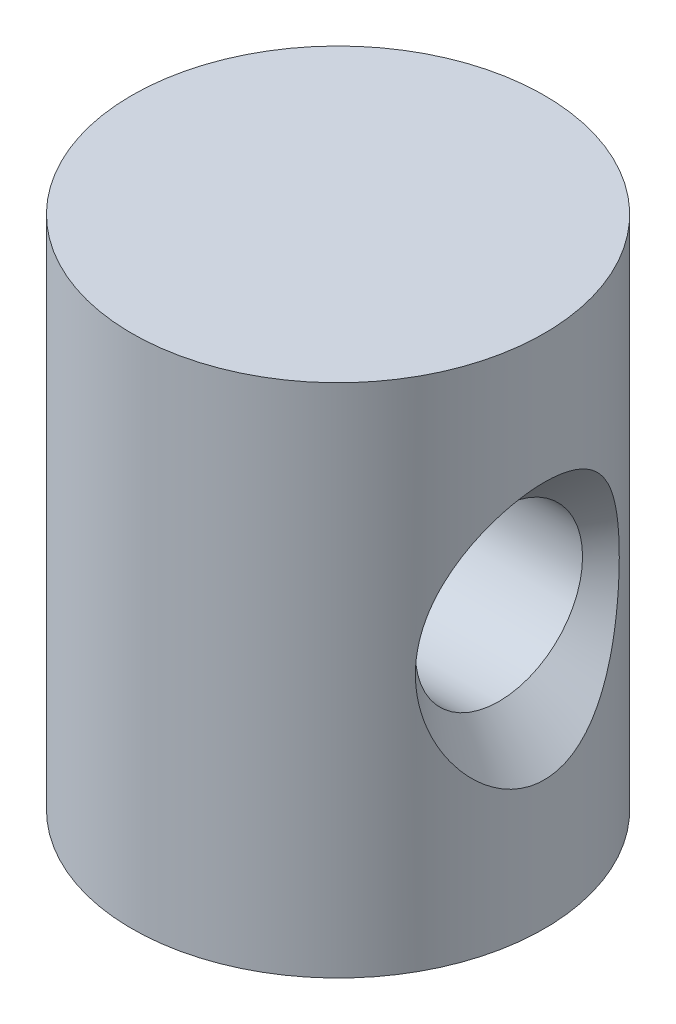
ISO-10303-21;
HEADER;
FILE_DESCRIPTION(('STEP AP214'),'2;1');
FILE_NAME('part.step','',(''),(''),'','','');
FILE_SCHEMA(('AUTOMOTIVE_DESIGN { 1 0 10303 214 1 1 1 1 }'));
ENDSEC;
DATA;
#1=APPLICATION_CONTEXT('core data for automotive mechanical design processes');
#2=APPLICATION_PROTOCOL_DEFINITION('international standard','automotive_design',2000,#1);
#3=PRODUCT_CONTEXT('',#1,'mechanical');
#4=PRODUCT('Part','Part','',(#3));
#5=PRODUCT_RELATED_PRODUCT_CATEGORY('part','',(#4));
#6=PRODUCT_DEFINITION_FORMATION('','',#4);
#7=PRODUCT_DEFINITION_CONTEXT('part definition',#1,'design');
#8=PRODUCT_DEFINITION('design','',#6,#7);
#9=PRODUCT_DEFINITION_SHAPE('','',#8);
#10=(LENGTH_UNIT() NAMED_UNIT(*) SI_UNIT(.MILLI.,.METRE.));
#11=(NAMED_UNIT(*) PLANE_ANGLE_UNIT() SI_UNIT($,.RADIAN.));
#12=(NAMED_UNIT(*) SI_UNIT($,.STERADIAN.) SOLID_ANGLE_UNIT());
#13=UNCERTAINTY_MEASURE_WITH_UNIT(LENGTH_MEASURE(1.E-05),#10,'distance_accuracy_value','');
#14=(GEOMETRIC_REPRESENTATION_CONTEXT(3) GLOBAL_UNCERTAINTY_ASSIGNED_CONTEXT((#13)) GLOBAL_UNIT_ASSIGNED_CONTEXT((#10,
#11,#12)) REPRESENTATION_CONTEXT('',''));
#15=CARTESIAN_POINT('',(0.,0.,0.));
#16=DIRECTION('',(0.,0.,1.));
#17=DIRECTION('',(1.,0.,0.));
#18=AXIS2_PLACEMENT_3D('',#15,#16,#17);
#19=CARTESIAN_POINT('',(0.,0.,0.));
#20=DIRECTION('',(0.,1.,0.));
#21=DIRECTION('',(0.,0.,-1.));
#22=AXIS2_PLACEMENT_3D('',#19,#20,#21);
#23=PLANE('',#22);
#24=CARTESIAN_POINT('',(0.,0.,0.));
#25=DIRECTION('',(0.,1.,0.));
#26=DIRECTION('',(-1.,0.,0.));
#27=AXIS2_PLACEMENT_3D('',#24,#25,#26);
#28=CIRCLE('',#27,4.);
#29=CARTESIAN_POINT('',(-4.,0.,0.));
#30=VERTEX_POINT('',#29);
#31=EDGE_CURVE('E57',#30,#30,#28,.T.);
#32=ORIENTED_EDGE('',*,*,#31,.T.);
#33=EDGE_LOOP('',(#32));
#34=FACE_BOUND('',#33,.T.);
#35=ADVANCED_FACE('F20',(#34),#23,.T.);
#36=CARTESIAN_POINT('',(0.,-10.,0.));
#37=DIRECTION('',(0.,1.,0.));
#38=DIRECTION('',(0.,0.,-1.));
#39=AXIS2_PLACEMENT_3D('',#36,#37,#38);
#40=PLANE('',#39);
#41=CARTESIAN_POINT('',(0.,-10.,0.));
#42=DIRECTION('',(0.,1.,0.));
#43=DIRECTION('',(-1.,0.,0.));
#44=AXIS2_PLACEMENT_3D('',#41,#42,#43);
#45=CIRCLE('',#44,4.);
#46=CARTESIAN_POINT('',(-4.,-10.,0.));
#47=VERTEX_POINT('',#46);
#48=EDGE_CURVE('E61',#47,#47,#45,.T.);
#49=ORIENTED_EDGE('',*,*,#48,.F.);
#50=EDGE_LOOP('',(#49));
#51=FACE_BOUND('',#50,.T.);
#52=ADVANCED_FACE('F111',(#51),#40,.F.);
#53=CARTESIAN_POINT('',(-4.,-5.,0.));
#54=DIRECTION('',(1.,0.,0.));
#55=DIRECTION('',(0.,1.,0.));
#56=AXIS2_PLACEMENT_3D('',#53,#54,#55);
#57=CYLINDRICAL_SURFACE('',#56,1.62111388575);
#58=CARTESIAN_POINT('',(-4.,-6.62111388575064,0.));
#59=CARTESIAN_POINT('',(-4.0000031563465,-6.6211166341962,-0.0340424655582793));
#60=CARTESIAN_POINT('',(-3.9991283741432,-6.61896729615456,-0.102102118052919));
#61=CARTESIAN_POINT('',(-3.99523878132131,-6.60934312198981,-0.203696124763147));
#62=CARTESIAN_POINT('',(-3.98811309567497,-6.59159958210959,-0.315525051694384));
#63=CARTESIAN_POINT('',(-3.97580413230919,-6.5606034394443,-0.447539362889413));
#64=CARTESIAN_POINT('',(-3.95580844935516,-6.50916375295717,-0.600436499064749));
#65=CARTESIAN_POINT('',(-3.9294737814188,-6.43893984092048,-0.752850624426931));
#66=CARTESIAN_POINT('',(-3.90051334808016,-6.35793544211989,-0.889622135762058));
#67=CARTESIAN_POINT('',(-3.87065284250014,-6.26982597941075,-1.01134800296146));
#68=CARTESIAN_POINT('',(-3.83358932772209,-6.15320612306202,-1.14497003034035));
#69=CARTESIAN_POINT('',(-3.78847992918991,-5.99589858506257,-1.28669053179811));
#70=CARTESIAN_POINT('',(-3.73928385536563,-5.79088567214044,-1.42247226859986));
#71=CARTESIAN_POINT('',(-3.70074468915172,-5.58134969620263,-1.51877881119369));
#72=CARTESIAN_POINT('',(-3.67482545953551,-5.37886876145371,-1.58000035688838));
#73=CARTESIAN_POINT('',(-3.66051794533255,-5.19614618858887,-1.61268838122111));
#74=CARTESIAN_POINT('',(-3.65690239272469,-5.06901625099303,-1.6208221871858));
#75=CARTESIAN_POINT('',(-3.65667087874105,-4.95424275231737,-1.621344555527));
#76=CARTESIAN_POINT('',(-3.65891590006348,-4.84662470350787,-1.61629271365919));
#77=CARTESIAN_POINT('',(-3.66853818385199,-4.69351073946442,-1.59441444805777));
#78=CARTESIAN_POINT('',(-3.68431092026829,-4.54234496588776,-1.55775328714847));
#79=CARTESIAN_POINT('',(-3.70544315534763,-4.39583155647951,-1.50697426063406));
#80=CARTESIAN_POINT('',(-3.73113523736669,-4.2546961106903,-1.44241705564248));
#81=CARTESIAN_POINT('',(-3.76053154464821,-4.11961100303797,-1.36422969273934));
#82=CARTESIAN_POINT('',(-3.79646829349626,-3.97632714034477,-1.26165104029577));
#83=CARTESIAN_POINT('',(-3.84083046670621,-3.82184845053826,-1.12170373757784));
#84=CARTESIAN_POINT('',(-3.89019093106858,-3.67050169278256,-0.938652135085345));
#85=CARTESIAN_POINT('',(-3.93177156992079,-3.5545395751291,-0.744231026198825));
#86=CARTESIAN_POINT('',(-3.96089622378604,-3.47761865991002,-0.565596344808428));
#87=CARTESIAN_POINT('',(-3.97934168461757,-3.43043273254769,-0.4143648096029));
#88=CARTESIAN_POINT('',(-3.9908100093343,-3.40165850312901,-0.280489101841771));
#89=CARTESIAN_POINT('',(-3.99672218940415,-3.38698450511603,-0.171311982666344));
#90=CARTESIAN_POINT('',(-3.99946121555641,-3.38021380402062,-0.0799570663653172));
#91=CARTESIAN_POINT('',(-4.00000171402734,-3.37888409713703,-0.0271568617674381));
#92=CARTESIAN_POINT('',(-4.,-3.37888611425,-5.36675928995767E-09));
#93=(BOUNDED_CURVE() B_SPLINE_CURVE(3,(#58,#59,#60,#61,#62,#63,#64,#65,#66,#67,#68,#69,#70,#71,
#72,#73,#74,#75,#76,#77,#78,#79,#80,#81,#82,#83,#84,#85,#86,#87,#88,#89,#90,#91,#92),
.UNSPECIFIED.,.F.,.F.) B_SPLINE_CURVE_WITH_KNOTS((4,1,1,1,1,1,1,1,1,1,1,1,1,1,1,1,1,1,1,1,1,1,1,
1,1,1,1,1,1,1,1,1,4),(0.,0.0198243570351821,0.0396438891503337,0.0594619951406752,
0.0858742539006231,0.118882069184403,0.154015924613544,0.184673792051416,0.212907971191001,
0.243185035390973,0.290128115607845,0.338704421606987,0.388894216455981,0.425881496405948,
0.462652492690109,0.497129731561603,0.499995819584017,0.52952044443138,0.559828609511032,
0.590145160333224,0.620496278252955,0.650880790520131,0.681698325661038,0.712916155050212,
0.75554847229542,0.805597074099872,0.853843286632708,0.889256957110858,0.91996930607599,
0.946638885231652,0.969230098030099,0.984166803630804,1.),
.UNSPECIFIED.) CURVE() GEOMETRIC_REPRESENTATION_ITEM() RATIONAL_B_SPLINE_CURVE((1.,1.,1.,1.,1.,
1.,1.,1.,1.,1.,1.,1.,1.,1.,1.,1.,1.,1.,1.,1.,1.,1.,1.,1.,1.,1.,1.,1.,1.,1.,1.,1.,1.,1.,1.)) REPRESENTATION_ITEM(''));
#94=CARTESIAN_POINT('',(-4.,-6.62111388575128,0.));
#95=VERTEX_POINT('',#94);
#96=CARTESIAN_POINT('',(-4.,-3.37888611425,0.));
#97=VERTEX_POINT('',#96);
#98=EDGE_CURVE('E67',#95,#97,#93,.T.);
#99=ORIENTED_EDGE('',*,*,#98,.F.);
#100=CARTESIAN_POINT('',(-4.,-3.37888611425,0.));
#101=CARTESIAN_POINT('',(-4.00000315669832,-3.37888336549198,0.0340443126539728));
#102=CARTESIAN_POINT('',(-3.99912832674584,-3.38103282040371,0.10210396419752));
#103=CARTESIAN_POINT('',(-3.99523866523971,-3.39065716701071,0.203697946046601));
#104=CARTESIAN_POINT('',(-3.98811309568607,-3.4084004178819,0.31552505169295));
#105=CARTESIAN_POINT('',(-3.97580413230465,-3.43939656055973,0.447539362892866));
#106=CARTESIAN_POINT('',(-3.9558084493565,-3.4908362470418,0.600436499064278));
#107=CARTESIAN_POINT('',(-3.92947378141848,-3.5610601590798,0.752850624427102));
#108=CARTESIAN_POINT('',(-3.90051334808023,-3.64206455788005,0.889622135762016));
#109=CARTESIAN_POINT('',(-3.87065284250012,-3.73017402058927,1.01134800296147));
#110=CARTESIAN_POINT('',(-3.8335893277221,-3.84679387693797,1.14497003034034));
#111=CARTESIAN_POINT('',(-3.78847992918991,-4.00410141493744,1.28669053179811));
#112=CARTESIAN_POINT('',(-3.73928385536563,-4.20911432785956,1.42247226859985));
#113=CARTESIAN_POINT('',(-3.70074468915172,-4.41865030379738,1.51877881119368));
#114=CARTESIAN_POINT('',(-3.67482545953551,-4.6211312385463,1.58000035688837));
#115=CARTESIAN_POINT('',(-3.66051794533255,-4.80385381141113,1.6126883812211));
#116=CARTESIAN_POINT('',(-3.65690239272469,-4.93098374900698,1.6208221871858));
#117=CARTESIAN_POINT('',(-3.65667087874105,-5.04575724768262,1.621344555527));
#118=CARTESIAN_POINT('',(-3.65891590006348,-5.15337529649213,1.61629271365918));
#119=CARTESIAN_POINT('',(-3.66853818385199,-5.30648926053558,1.59441444805776));
#120=CARTESIAN_POINT('',(-3.68431092026829,-5.45765503411224,1.55775328714847));
#121=CARTESIAN_POINT('',(-3.70544315534763,-5.60416844352049,1.50697426063406));
#122=CARTESIAN_POINT('',(-3.73113523736668,-5.7453038893097,1.44241705564248));
#123=CARTESIAN_POINT('',(-3.76053154464821,-5.88038899696202,1.36422969273932));
#124=CARTESIAN_POINT('',(-3.79646829349626,-6.02367285965523,1.26165104029582));
#125=CARTESIAN_POINT('',(-3.84083046670621,-6.17815154946174,1.12170373757758));
#126=CARTESIAN_POINT('',(-3.89019093106858,-6.32949830721743,0.938652135086503));
#127=CARTESIAN_POINT('',(-3.93177156992079,-6.44546042487091,0.74423102619518));
#128=CARTESIAN_POINT('',(-3.96089622378604,-6.52238134008997,0.565596344817542));
#129=CARTESIAN_POINT('',(-3.97934168461757,-6.56956726745231,0.414364809575248));
#130=CARTESIAN_POINT('',(-3.9908100093343,-6.59834149687098,0.280489101924734));
#131=CARTESIAN_POINT('',(-3.99672218940415,-6.61301549488402,0.171311982444031));
#132=CARTESIAN_POINT('',(-3.99946121555641,-6.61978619597928,0.0799570669043548));
#133=CARTESIAN_POINT('',(-4.00000171402734,-6.62111590286322,0.0271568605122614));
#134=CARTESIAN_POINT('',(-4.,-6.62111388575064,2.15696118997857E-09));
#135=(BOUNDED_CURVE() B_SPLINE_CURVE(3,(#100,#101,#102,#103,#104,#105,#106,#107,#108,#109,#110,
#111,#112,#113,#114,#115,#116,#117,#118,#119,#120,#121,#122,#123,#124,#125,#126,#127,#128,#129,
#130,#131,#132,#133,#134),.UNSPECIFIED.,.F.,.F.) B_SPLINE_CURVE_WITH_KNOTS((4,1,1,1,1,1,1,1,1,1,
1,1,1,1,1,1,1,1,1,1,1,1,1,1,1,1,1,1,1,1,1,1,4),(0.,0.0198254327335299,0.0396438891524231,
0.0594619951411881,0.0858742539007881,0.118882069184395,0.154015924613537,0.18467379205141,
0.212907971190994,0.243185035390966,0.290128115607839,0.338704421606981,0.388894216455975,
0.425881496405943,0.462652492690104,0.497129731561599,0.499995819584012,0.529520444431375,
0.559828609511028,0.590145160333219,0.62049627825295,0.650880790520128,0.681698325661035,
0.712916155050208,0.755548472295417,0.805597074099869,0.853843286632703,0.889256957110856,
0.919969306075988,0.94663888523165,0.969230098030106,0.984166803630812,1.),
.UNSPECIFIED.) CURVE() GEOMETRIC_REPRESENTATION_ITEM() RATIONAL_B_SPLINE_CURVE((1.,1.,1.,1.,1.,
1.,1.,1.,1.,1.,1.,1.,1.,1.,1.,1.,1.,1.,1.,1.,1.,1.,1.,1.,1.,1.,1.,1.,1.,1.,1.,1.,1.,1.,1.)) REPRESENTATION_ITEM(''));
#136=EDGE_CURVE('E60',#97,#95,#135,.T.);
#137=ORIENTED_EDGE('',*,*,#136,.F.);
#138=EDGE_LOOP('',(#99,#137));
#139=FACE_BOUND('',#138,.T.);
#140=CARTESIAN_POINT('',(3.12111388575,-5.,0.));
#141=DIRECTION('',(1.,0.,0.));
#142=DIRECTION('',(0.,1.,0.));
#143=AXIS2_PLACEMENT_3D('',#140,#141,#142);
#144=CIRCLE('',#143,1.62111388575);
#145=CARTESIAN_POINT('',(3.12111388575,-3.37888611425,0.));
#146=VERTEX_POINT('',#145);
#147=EDGE_CURVE('E12',#146,#146,#144,.T.);
#148=ORIENTED_EDGE('',*,*,#147,.T.);
#149=EDGE_LOOP('',(#148));
#150=FACE_BOUND('',#149,.T.);
#151=ADVANCED_FACE('F103',(#139,#150),#57,.F.);
#152=CARTESIAN_POINT('',(3.56055758567445,-5.,0.));
#153=DIRECTION('',(1.,0.,0.));
#154=DIRECTION('',(0.,1.,0.));
#155=AXIS2_PLACEMENT_3D('',#152,#153,#154);
#156=CONICAL_SURFACE('',#155,2.06055758567445,0.785398163397448);
#157=CARTESIAN_POINT('',(4.00000000000051,-2.49999999999949,3.57056918753873E-12));
#158=CARTESIAN_POINT('',(3.99999996586396,-2.50000003802693,-0.030121704228556));
#159=CARTESIAN_POINT('',(3.99933834679552,-2.50171965236509,-0.0886551598392516));
#160=CARTESIAN_POINT('',(3.99639128501168,-2.5093905943826,-0.177263054994165));
#161=CARTESIAN_POINT('',(3.99131702137036,-2.52263551490217,-0.269104908488694));
#162=CARTESIAN_POINT('',(3.98241320718837,-2.54598483297339,-0.381528681956324));
#163=CARTESIAN_POINT('',(3.96781820478604,-2.58456926022726,-0.513545920062348));
#164=CARTESIAN_POINT('',(3.94593271319445,-2.64329633188486,-0.661157702460623));
#165=CARTESIAN_POINT('',(3.91981796567723,-2.71483493244556,-0.800870810995421));
#166=CARTESIAN_POINT('',(3.89031234689391,-2.79774184931408,-0.933267921452824));
#167=CARTESIAN_POINT('',(3.85716069850274,-2.89364285637817,-1.06229777079005));
#168=CARTESIAN_POINT('',(3.81840657256043,-3.01013062634908,-1.1942916876901));
#169=CARTESIAN_POINT('',(3.77402777102267,-3.15049408480559,-1.3278824803699));
#170=CARTESIAN_POINT('',(3.72628308608884,-3.31184866125678,-1.45631910068388));
#171=CARTESIAN_POINT('',(3.67698836978961,-3.49337558016868,-1.57635505127635));
#172=CARTESIAN_POINT('',(3.62906012583438,-3.69023912384516,-1.68344619252777));
#173=CARTESIAN_POINT('',(3.58454736654103,-3.90060870623639,-1.77594287992062));
#174=CARTESIAN_POINT('',(3.54568885053803,-4.12091625549376,-1.85203096912344));
#175=CARTESIAN_POINT('',(3.51414404627967,-4.34933535408078,-1.91098332937587));
#176=CARTESIAN_POINT('',(3.49137393998363,-4.58328100700552,-1.95211033716789));
#177=CARTESIAN_POINT('',(3.47946775690529,-4.80101739021413,-1.97315617035474));
#178=CARTESIAN_POINT('',(3.47683865881683,-4.96098615117532,-1.97777485735494));
#179=CARTESIAN_POINT('',(3.4777561309333,-5.12241879631714,-1.976160757368));
#180=CARTESIAN_POINT('',(3.48400520778564,-5.30760479043545,-1.96518076833696));
#181=CARTESIAN_POINT('',(3.50343813736603,-5.5550642602611,-1.9304883469209));
#182=CARTESIAN_POINT('',(3.53387907238733,-5.80275179332248,-1.8744564028676));
#183=CARTESIAN_POINT('',(3.57389608403542,-6.04465635160734,-1.79734381832013));
#184=CARTESIAN_POINT('',(3.62091551941573,-6.27441486419591,-1.70101906818169));
#185=CARTESIAN_POINT('',(3.67225059990424,-6.48873771390361,-1.58757009988617));
#186=CARTESIAN_POINT('',(3.72415583493882,-6.68088319609502,-1.46195391987626));
#187=CARTESIAN_POINT('',(3.77348303660644,-6.84774017665104,-1.32944644546857));
#188=CARTESIAN_POINT('',(3.82031701223636,-6.9959505990072,-1.18862191656326));
#189=CARTESIAN_POINT('',(3.86352918986095,-7.12531635412874,-1.04017961293357));
#190=CARTESIAN_POINT('',(3.90166518762731,-7.23455861364833,-0.885990775068883));
#191=CARTESIAN_POINT('',(3.93169801921501,-7.31789584409016,-0.740605674522871));
#192=CARTESIAN_POINT('',(3.95723073407728,-7.38717634067478,-0.590125318945098));
#193=CARTESIAN_POINT('',(3.97985839891794,-7.44738700474906,-0.416622785658002));
#194=CARTESIAN_POINT('',(3.99615504700983,-7.49002268770277,-0.215030469467505));
#195=CARTESIAN_POINT('',(4.00009945863062,-7.50025859063732,-0.066721697897177));
#196=CARTESIAN_POINT('',(3.99988939163708,-7.49971236447106,0.0821980457194884));
#197=CARTESIAN_POINT('',(3.99511468053135,-7.48732261147424,0.236010910464835));
#198=CARTESIAN_POINT('',(3.97582959294541,-7.43679292322488,0.456927803732192));
#199=CARTESIAN_POINT('',(3.94485182725808,-7.35403001820525,0.673607393161241));
#200=CARTESIAN_POINT('',(3.90479562307475,-7.24371998568687,0.875084113162794));
#201=CARTESIAN_POINT('',(3.86011010520051,-7.11542204378461,1.0530854832262));
#202=CARTESIAN_POINT('',(3.8111919014095,-6.96803030781393,1.21825558963246));
#203=CARTESIAN_POINT('',(3.75649356654919,-6.79270389448881,1.37794826552703));
#204=CARTESIAN_POINT('',(3.69496051315124,-6.57671349037276,1.53498126611675));
#205=CARTESIAN_POINT('',(3.63783838121459,-6.34922144642304,1.66478970110569));
#206=CARTESIAN_POINT('',(3.58870344334002,-6.12058261396534,1.76756252841836));
#207=CARTESIAN_POINT('',(3.5491398747403,-5.90069641686376,1.84543464527024));
#208=CARTESIAN_POINT('',(3.51682079977397,-5.67297289066085,1.9060725635655));
#209=CARTESIAN_POINT('',(3.49298045617475,-5.43769057008733,1.94925007866439));
#210=CARTESIAN_POINT('',(3.47983712978871,-5.21260585510045,1.97250939918933));
#211=CARTESIAN_POINT('',(3.47686780420752,-5.04850149787139,1.97772360400085));
#212=CARTESIAN_POINT('',(3.47765513899741,-4.88173898500962,1.97633841846665));
#213=CARTESIAN_POINT('',(3.48366489384752,-4.69748363614982,1.96578528266537));
#214=CARTESIAN_POINT('',(3.50295815198896,-4.45041215557217,1.93134971509302));
#215=CARTESIAN_POINT('',(3.53228674478635,-4.20925114334913,1.87740550274844));
#216=CARTESIAN_POINT('',(3.5700523721221,-3.97701779396228,1.80485653294797));
#217=CARTESIAN_POINT('',(3.6143069606544,-3.75608208146934,1.71484828963605));
#218=CARTESIAN_POINT('',(3.66647669641623,-3.5332798537881,1.60101309551273));
#219=CARTESIAN_POINT('',(3.72437692446551,-3.31712594509025,1.46239432122484));
#220=CARTESIAN_POINT('',(3.78431002180873,-3.11636288984567,1.29975826473886));
#221=CARTESIAN_POINT('',(3.83312752942204,-2.96515397288305,1.14672087718614));
#222=CARTESIAN_POINT('',(3.87043096592492,-2.85499572165633,1.01209867458446));
#223=CARTESIAN_POINT('',(3.89740071771256,-2.77773703938814,0.902347163016379));
#224=CARTESIAN_POINT('',(3.92028077386662,-2.71369717313857,0.796896379980265));
#225=CARTESIAN_POINT('',(3.93997275403655,-2.65960114454342,0.693108001816476));
#226=CARTESIAN_POINT('',(3.95729057112336,-2.6127691203032,0.58637492150595));
#227=CARTESIAN_POINT('',(3.97174853138577,-2.57417891475397,0.478724241726292));
#228=CARTESIAN_POINT('',(3.98303551035519,-2.54435618822256,0.372862870623317));
#229=CARTESIAN_POINT('',(3.99086656039665,-2.52381474588129,0.275457021820679));
#230=CARTESIAN_POINT('',(3.99584187157413,-2.51082341095786,0.188174530936989));
#231=CARTESIAN_POINT('',(3.99853838574965,-2.50380128309442,0.114943420591218));
#232=CARTESIAN_POINT('',(3.99977048422398,-2.50059665825529,0.053199313016184));
#233=CARTESIAN_POINT('',(4.00000001906644,-2.49999997876042,0.0168235659600927));
#234=CARTESIAN_POINT('',(4.00000000000051,-2.49999999999949,3.57056918753873E-12));
#235=(BOUNDED_CURVE() B_SPLINE_CURVE(3,(#157,#158,#159,#160,#161,#162,#163,#164,#165,#166,#167,
#168,#169,#170,#171,#172,#173,#174,#175,#176,#177,#178,#179,#180,#181,#182,#183,#184,#185,#186,
#187,#188,#189,#190,#191,#192,#193,#194,#195,#196,#197,#198,#199,#200,#201,#202,#203,#204,#205,
#206,#207,#208,#209,#210,#211,#212,#213,#214,#215,#216,#217,#218,#219,#220,#221,#222,#223,#224,
#225,#226,#227,#228,#229,#230,#231,#232,#233,#234),.UNSPECIFIED.,.T.,
.F.) B_SPLINE_CURVE_WITH_KNOTS((4,1,1,1,1,1,1,1,1,1,1,1,1,1,1,1,1,1,1,1,1,1,1,1,1,1,1,1,1,1,1,1,
1,1,1,1,1,1,1,1,1,1,1,1,1,1,1,1,1,1,1,1,1,1,1,1,1,1,1,1,1,1,1,1,1,1,1,1,1,1,1,1,1,1,1,4),(-1.,
-0.993673230500097,-0.987704091604336,-0.981334490386021,-0.974187646477769,-0.963545562729502,
-0.952335242425189,-0.940568364080829,-0.930177422990681,-0.918988901291006,-0.906125083493818,
-0.892369847583536,-0.877273771994394,-0.861723308650029,-0.845545779291276,-0.82919200886838,
-0.812606199291329,-0.795964363874261,-0.779255433258084,-0.762536867556295,-0.75000115551451,
-0.745659163108416,-0.728632714835445,-0.711057135387509,-0.693079553648356,-0.674972417812414,
-0.65713590781791,-0.639889732475611,-0.622964604955863,-0.607771208864449,-0.593994294288688,
-0.578966078791786,-0.565490636975541,-0.553569973137078,-0.543262380818354,-0.530336492178955,
-0.514792834658619,-0.499999530506823,-0.499209805318204,-0.483537495273062,-0.467696117276082,
-0.451608880597478,-0.434542345525534,-0.418861510107143,-0.404670468488887,-0.386987071789252,
-0.367831244249632,-0.347203820421086,-0.330771484185481,-0.314232768830158,-0.297559902611482,
-0.280860061718423,-0.263795837532416,-0.250002706119652,-0.246395592916059,-0.228773278426973,
-0.211264775099838,-0.19390056278233,-0.176564822363477,-0.159604680950615,-0.142991431691406,
-0.122942975611842,-0.104403360637435,-0.0873733707702689,-0.0766918219448359,
-0.0670700087161006,-0.0586500832756551,-0.0503613399509329,-0.04217073510334,
-0.0339276074728999,-0.0261854002041523,-0.0189767670897422,-0.0129772457942846,
-0.00763983970299969,-0.00353362555959901,0.),
.UNSPECIFIED.) CURVE() GEOMETRIC_REPRESENTATION_ITEM() RATIONAL_B_SPLINE_CURVE((1.,1.,1.,1.,1.,
1.,1.,1.,1.,1.,1.,1.,1.,1.,1.,1.,1.,1.,1.,1.,1.,1.,1.,1.,1.,1.,1.,1.,1.,1.,1.,1.,1.,1.,1.,1.,1.,
1.,1.,1.,1.,1.,1.,1.,1.,1.,1.,1.,1.,1.,1.,1.,1.,1.,1.,1.,1.,1.,1.,1.,1.,1.,1.,1.,1.,1.,1.,1.,1.,
1.,1.,1.,1.,1.,1.,1.,1.,1.)) REPRESENTATION_ITEM(''));
#236=CARTESIAN_POINT('',(4.00000000000101,-2.49999999999899,0.));
#237=VERTEX_POINT('',#236);
#238=EDGE_CURVE('E29',#237,#237,#235,.T.);
#239=ORIENTED_EDGE('',*,*,#238,.F.);
#240=EDGE_LOOP('',(#239));
#241=FACE_BOUND('',#240,.T.);
#242=ORIENTED_EDGE('',*,*,#147,.F.);
#243=EDGE_LOOP('',(#242));
#244=FACE_BOUND('',#243,.T.);
#245=ADVANCED_FACE('F100',(#241,#244),#156,.F.);
#246=CARTESIAN_POINT('',(0.,-10.,0.));
#247=DIRECTION('',(0.,1.,0.));
#248=DIRECTION('',(-1.,0.,0.));
#249=AXIS2_PLACEMENT_3D('',#246,#247,#248);
#250=CYLINDRICAL_SURFACE('',#249,4.);
#251=ORIENTED_EDGE('',*,*,#238,.T.);
#252=EDGE_LOOP('',(#251));
#253=FACE_BOUND('',#252,.T.);
#254=ORIENTED_EDGE('',*,*,#136,.T.);
#255=ORIENTED_EDGE('',*,*,#98,.T.);
#256=EDGE_LOOP('',(#254,#255));
#257=FACE_BOUND('',#256,.T.);
#258=ORIENTED_EDGE('',*,*,#31,.F.);
#259=EDGE_LOOP('',(#258));
#260=FACE_BOUND('',#259,.T.);
#261=ORIENTED_EDGE('',*,*,#48,.T.);
#262=EDGE_LOOP('',(#261));
#263=FACE_BOUND('',#262,.T.);
#264=ADVANCED_FACE('F97',(#253,#257,#260,#263),#250,.T.);
#265=CLOSED_SHELL('',(#35,#52,#151,#245,#264));
#266=MANIFOLD_SOLID_BREP('B1',#265);
#267=ADVANCED_BREP_SHAPE_REPRESENTATION('',(#18,#266),#14);
#268=SHAPE_DEFINITION_REPRESENTATION(#9,#267);
ENDSEC;
END-ISO-10303-21;
